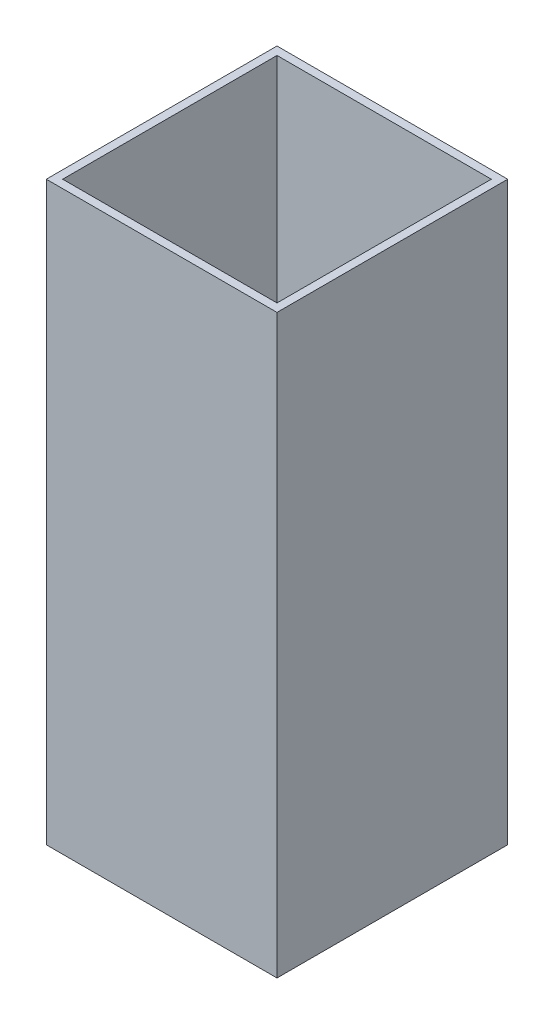
ISO-10303-21;
HEADER;
FILE_DESCRIPTION(('STEP AP214'),'2;1');
FILE_NAME('part.step','',(''),(''),'','','');
FILE_SCHEMA(('AUTOMOTIVE_DESIGN { 1 0 10303 214 1 1 1 1 }'));
ENDSEC;
DATA;
#1=APPLICATION_CONTEXT('core data for automotive mechanical design processes');
#2=APPLICATION_PROTOCOL_DEFINITION('international standard','automotive_design',2000,#1);
#3=PRODUCT_CONTEXT('',#1,'mechanical');
#4=PRODUCT('Part','Part','',(#3));
#5=PRODUCT_RELATED_PRODUCT_CATEGORY('part','',(#4));
#6=PRODUCT_DEFINITION_FORMATION('','',#4);
#7=PRODUCT_DEFINITION_CONTEXT('part definition',#1,'design');
#8=PRODUCT_DEFINITION('design','',#6,#7);
#9=PRODUCT_DEFINITION_SHAPE('','',#8);
#10=(LENGTH_UNIT() NAMED_UNIT(*) SI_UNIT(.MILLI.,.METRE.));
#11=(NAMED_UNIT(*) PLANE_ANGLE_UNIT() SI_UNIT($,.RADIAN.));
#12=(NAMED_UNIT(*) SI_UNIT($,.STERADIAN.) SOLID_ANGLE_UNIT());
#13=UNCERTAINTY_MEASURE_WITH_UNIT(LENGTH_MEASURE(1.E-05),#10,'distance_accuracy_value','');
#14=(GEOMETRIC_REPRESENTATION_CONTEXT(3) GLOBAL_UNCERTAINTY_ASSIGNED_CONTEXT((#13)) GLOBAL_UNIT_ASSIGNED_CONTEXT((#10,
#11,#12)) REPRESENTATION_CONTEXT('',''));
#15=CARTESIAN_POINT('',(0.,0.,0.));
#16=DIRECTION('',(0.,0.,1.));
#17=DIRECTION('',(1.,0.,0.));
#18=AXIS2_PLACEMENT_3D('',#15,#16,#17);
#19=CARTESIAN_POINT('',(50.75,3.6,-50.75));
#20=DIRECTION('',(-1.,0.,0.));
#21=DIRECTION('',(0.,0.,1.));
#22=AXIS2_PLACEMENT_3D('',#19,#20,#21);
#23=PLANE('',#22);
#24=DIRECTION('',(0.,0.,-1.));
#25=VECTOR('',#24,1.);
#26=CARTESIAN_POINT('',(50.75,0.,-50.75));
#27=LINE('',#26,#25);
#28=CARTESIAN_POINT('',(50.75,0.,50.75));
#29=VERTEX_POINT('',#28);
#30=CARTESIAN_POINT('',(50.75,0.,-50.75));
#31=VERTEX_POINT('',#30);
#32=EDGE_CURVE('E147',#29,#31,#27,.T.);
#33=ORIENTED_EDGE('',*,*,#32,.T.);
#34=DIRECTION('',(0.,-1.,0.));
#35=VECTOR('',#34,1.);
#36=CARTESIAN_POINT('',(50.75,3.6,-50.75));
#37=LINE('',#36,#35);
#38=CARTESIAN_POINT('',(50.75,253.6,-50.75));
#39=VERTEX_POINT('',#38);
#40=EDGE_CURVE('E11',#39,#31,#37,.T.);
#41=ORIENTED_EDGE('',*,*,#40,.F.);
#42=DIRECTION('',(0.,0.,-1.));
#43=VECTOR('',#42,1.);
#44=CARTESIAN_POINT('',(50.75,253.6,50.75));
#45=LINE('',#44,#43);
#46=CARTESIAN_POINT('',(50.75,253.6,50.75));
#47=VERTEX_POINT('',#46);
#48=EDGE_CURVE('E138',#47,#39,#45,.T.);
#49=ORIENTED_EDGE('',*,*,#48,.F.);
#50=DIRECTION('',(0.,-1.,0.));
#51=VECTOR('',#50,1.);
#52=CARTESIAN_POINT('',(50.75,3.6,50.75));
#53=LINE('',#52,#51);
#54=EDGE_CURVE('E156',#47,#29,#53,.T.);
#55=ORIENTED_EDGE('',*,*,#54,.T.);
#56=EDGE_LOOP('',(#33,#41,#49,#55));
#57=FACE_BOUND('',#56,.T.);
#58=ADVANCED_FACE('F36',(#57),#23,.F.);
#59=CARTESIAN_POINT('',(-50.75,3.6,-50.75));
#60=DIRECTION('',(0.,0.,1.));
#61=DIRECTION('',(1.,0.,0.));
#62=AXIS2_PLACEMENT_3D('',#59,#60,#61);
#63=PLANE('',#62);
#64=DIRECTION('',(-1.,0.,0.));
#65=VECTOR('',#64,1.);
#66=CARTESIAN_POINT('',(-50.75,0.,-50.75));
#67=LINE('',#66,#65);
#68=CARTESIAN_POINT('',(-50.75,0.,-50.75));
#69=VERTEX_POINT('',#68);
#70=EDGE_CURVE('E150',#31,#69,#67,.T.);
#71=ORIENTED_EDGE('',*,*,#70,.T.);
#72=DIRECTION('',(0.,-1.,0.));
#73=VECTOR('',#72,1.);
#74=CARTESIAN_POINT('',(-50.75,3.6,-50.75));
#75=LINE('',#74,#73);
#76=CARTESIAN_POINT('',(-50.75,253.6,-50.75));
#77=VERTEX_POINT('',#76);
#78=EDGE_CURVE('E43',#77,#69,#75,.T.);
#79=ORIENTED_EDGE('',*,*,#78,.F.);
#80=DIRECTION('',(-1.,0.,0.));
#81=VECTOR('',#80,1.);
#82=CARTESIAN_POINT('',(50.75,253.6,-50.75));
#83=LINE('',#82,#81);
#84=EDGE_CURVE('E141',#39,#77,#83,.T.);
#85=ORIENTED_EDGE('',*,*,#84,.F.);
#86=ORIENTED_EDGE('',*,*,#40,.T.);
#87=EDGE_LOOP('',(#71,#79,#85,#86));
#88=FACE_BOUND('',#87,.T.);
#89=ADVANCED_FACE('F178',(#88),#63,.F.);
#90=CARTESIAN_POINT('',(-50.75,3.6,-50.75));
#91=DIRECTION('',(1.,0.,0.));
#92=DIRECTION('',(0.,0.,-1.));
#93=AXIS2_PLACEMENT_3D('',#90,#91,#92);
#94=PLANE('',#93);
#95=DIRECTION('',(0.,0.,1.));
#96=VECTOR('',#95,1.);
#97=CARTESIAN_POINT('',(-50.75,0.,-50.75));
#98=LINE('',#97,#96);
#99=CARTESIAN_POINT('',(-50.75,0.,50.75));
#100=VERTEX_POINT('',#99);
#101=EDGE_CURVE('E152',#69,#100,#98,.T.);
#102=ORIENTED_EDGE('',*,*,#101,.T.);
#103=DIRECTION('',(0.,-1.,0.));
#104=VECTOR('',#103,1.);
#105=CARTESIAN_POINT('',(-50.75,3.6,50.75));
#106=LINE('',#105,#104);
#107=CARTESIAN_POINT('',(-50.75,253.6,50.75));
#108=VERTEX_POINT('',#107);
#109=EDGE_CURVE('E159',#108,#100,#106,.T.);
#110=ORIENTED_EDGE('',*,*,#109,.F.);
#111=DIRECTION('',(0.,0.,1.));
#112=VECTOR('',#111,1.);
#113=CARTESIAN_POINT('',(-50.75,253.6,-50.75));
#114=LINE('',#113,#112);
#115=EDGE_CURVE('E144',#77,#108,#114,.T.);
#116=ORIENTED_EDGE('',*,*,#115,.F.);
#117=ORIENTED_EDGE('',*,*,#78,.T.);
#118=EDGE_LOOP('',(#102,#110,#116,#117));
#119=FACE_BOUND('',#118,.T.);
#120=ADVANCED_FACE('F165',(#119),#94,.F.);
#121=CARTESIAN_POINT('',(-50.75,3.6,50.75));
#122=DIRECTION('',(0.,0.,-1.));
#123=DIRECTION('',(-1.,0.,0.));
#124=AXIS2_PLACEMENT_3D('',#121,#122,#123);
#125=PLANE('',#124);
#126=DIRECTION('',(1.,0.,0.));
#127=VECTOR('',#126,1.);
#128=CARTESIAN_POINT('',(-50.75,0.,50.75));
#129=LINE('',#128,#127);
#130=EDGE_CURVE('E154',#100,#29,#129,.T.);
#131=ORIENTED_EDGE('',*,*,#130,.T.);
#132=ORIENTED_EDGE('',*,*,#54,.F.);
#133=DIRECTION('',(1.,0.,0.));
#134=VECTOR('',#133,1.);
#135=CARTESIAN_POINT('',(-50.75,253.6,50.75));
#136=LINE('',#135,#134);
#137=EDGE_CURVE('E114',#108,#47,#136,.T.);
#138=ORIENTED_EDGE('',*,*,#137,.F.);
#139=ORIENTED_EDGE('',*,*,#109,.T.);
#140=EDGE_LOOP('',(#131,#132,#138,#139));
#141=FACE_BOUND('',#140,.T.);
#142=ADVANCED_FACE('F173',(#141),#125,.F.);
#143=CARTESIAN_POINT('',(0.,0.,0.));
#144=DIRECTION('',(0.,1.,0.));
#145=DIRECTION('',(0.,0.,1.));
#146=AXIS2_PLACEMENT_3D('',#143,#144,#145);
#147=PLANE('',#146);
#148=ORIENTED_EDGE('',*,*,#32,.F.);
#149=ORIENTED_EDGE('',*,*,#130,.F.);
#150=ORIENTED_EDGE('',*,*,#101,.F.);
#151=ORIENTED_EDGE('',*,*,#70,.F.);
#152=EDGE_LOOP('',(#148,#149,#150,#151));
#153=FACE_BOUND('',#152,.T.);
#154=ADVANCED_FACE('F171',(#153),#147,.F.);
#155=CARTESIAN_POINT('',(0.,253.6,0.));
#156=DIRECTION('',(0.,1.,0.));
#157=DIRECTION('',(0.,0.,1.));
#158=AXIS2_PLACEMENT_3D('',#155,#156,#157);
#159=PLANE('',#158);
#160=ORIENTED_EDGE('',*,*,#137,.T.);
#161=ORIENTED_EDGE('',*,*,#48,.T.);
#162=ORIENTED_EDGE('',*,*,#84,.T.);
#163=ORIENTED_EDGE('',*,*,#115,.T.);
#164=EDGE_LOOP('',(#160,#161,#162,#163));
#165=FACE_BOUND('',#164,.T.);
#166=DIRECTION('',(0.,0.,-1.));
#167=VECTOR('',#166,1.);
#168=CARTESIAN_POINT('',(47.15,253.6,47.15));
#169=LINE('',#168,#167);
#170=CARTESIAN_POINT('',(47.15,253.6,47.15));
#171=VERTEX_POINT('',#170);
#172=CARTESIAN_POINT('',(47.15,253.6,-47.15));
#173=VERTEX_POINT('',#172);
#174=EDGE_CURVE('E108',#171,#173,#169,.T.);
#175=ORIENTED_EDGE('',*,*,#174,.F.);
#176=DIRECTION('',(1.,0.,0.));
#177=VECTOR('',#176,1.);
#178=CARTESIAN_POINT('',(-47.15,253.6,47.15));
#179=LINE('',#178,#177);
#180=CARTESIAN_POINT('',(-47.15,253.6,47.15));
#181=VERTEX_POINT('',#180);
#182=EDGE_CURVE('E99',#181,#171,#179,.T.);
#183=ORIENTED_EDGE('',*,*,#182,.F.);
#184=DIRECTION('',(0.,0.,1.));
#185=VECTOR('',#184,1.);
#186=CARTESIAN_POINT('',(-47.15,253.6,-47.15));
#187=LINE('',#186,#185);
#188=CARTESIAN_POINT('',(-47.15,253.6,-47.15));
#189=VERTEX_POINT('',#188);
#190=EDGE_CURVE('E122',#189,#181,#187,.T.);
#191=ORIENTED_EDGE('',*,*,#190,.F.);
#192=DIRECTION('',(-1.,0.,0.));
#193=VECTOR('',#192,1.);
#194=CARTESIAN_POINT('',(47.15,253.6,-47.15));
#195=LINE('',#194,#193);
#196=EDGE_CURVE('E120',#173,#189,#195,.T.);
#197=ORIENTED_EDGE('',*,*,#196,.F.);
#198=EDGE_LOOP('',(#175,#183,#191,#197));
#199=FACE_BOUND('',#198,.T.);
#200=ADVANCED_FACE('F118',(#165,#199),#159,.T.);
#201=CARTESIAN_POINT('',(-47.15,253.6,47.15));
#202=DIRECTION('',(0.,0.,-1.));
#203=DIRECTION('',(-1.,0.,0.));
#204=AXIS2_PLACEMENT_3D('',#201,#202,#203);
#205=PLANE('',#204);
#206=DIRECTION('',(1.,0.,0.));
#207=VECTOR('',#206,1.);
#208=CARTESIAN_POINT('',(-47.15,3.6,47.15));
#209=LINE('',#208,#207);
#210=CARTESIAN_POINT('',(-47.15,3.6,47.15));
#211=VERTEX_POINT('',#210);
#212=CARTESIAN_POINT('',(47.15,3.6,47.15));
#213=VERTEX_POINT('',#212);
#214=EDGE_CURVE('E50',#211,#213,#209,.T.);
#215=ORIENTED_EDGE('',*,*,#214,.F.);
#216=DIRECTION('',(0.,-1.,0.));
#217=VECTOR('',#216,1.);
#218=CARTESIAN_POINT('',(-47.15,253.6,47.15));
#219=LINE('',#218,#217);
#220=EDGE_CURVE('E104',#181,#211,#219,.T.);
#221=ORIENTED_EDGE('',*,*,#220,.F.);
#222=ORIENTED_EDGE('',*,*,#182,.T.);
#223=DIRECTION('',(0.,-1.,0.));
#224=VECTOR('',#223,1.);
#225=CARTESIAN_POINT('',(47.15,253.6,47.15));
#226=LINE('',#225,#224);
#227=EDGE_CURVE('E102',#171,#213,#226,.T.);
#228=ORIENTED_EDGE('',*,*,#227,.T.);
#229=EDGE_LOOP('',(#215,#221,#222,#228));
#230=FACE_BOUND('',#229,.T.);
#231=ADVANCED_FACE('F101',(#230),#205,.T.);
#232=CARTESIAN_POINT('',(47.15,253.6,47.15));
#233=DIRECTION('',(-1.,0.,0.));
#234=DIRECTION('',(0.,0.,1.));
#235=AXIS2_PLACEMENT_3D('',#232,#233,#234);
#236=PLANE('',#235);
#237=DIRECTION('',(0.,0.,-1.));
#238=VECTOR('',#237,1.);
#239=CARTESIAN_POINT('',(47.15,3.6,47.15));
#240=LINE('',#239,#238);
#241=CARTESIAN_POINT('',(47.15,3.6,-47.15));
#242=VERTEX_POINT('',#241);
#243=EDGE_CURVE('E54',#213,#242,#240,.T.);
#244=ORIENTED_EDGE('',*,*,#243,.F.);
#245=ORIENTED_EDGE('',*,*,#227,.F.);
#246=ORIENTED_EDGE('',*,*,#174,.T.);
#247=DIRECTION('',(0.,-1.,0.));
#248=VECTOR('',#247,1.);
#249=CARTESIAN_POINT('',(47.15,253.6,-47.15));
#250=LINE('',#249,#248);
#251=EDGE_CURVE('E115',#173,#242,#250,.T.);
#252=ORIENTED_EDGE('',*,*,#251,.T.);
#253=EDGE_LOOP('',(#244,#245,#246,#252));
#254=FACE_BOUND('',#253,.T.);
#255=ADVANCED_FACE('F112',(#254),#236,.T.);
#256=CARTESIAN_POINT('',(47.15,253.6,-47.15));
#257=DIRECTION('',(0.,0.,1.));
#258=DIRECTION('',(1.,0.,0.));
#259=AXIS2_PLACEMENT_3D('',#256,#257,#258);
#260=PLANE('',#259);
#261=DIRECTION('',(-1.,0.,0.));
#262=VECTOR('',#261,1.);
#263=CARTESIAN_POINT('',(47.15,3.6,-47.15));
#264=LINE('',#263,#262);
#265=CARTESIAN_POINT('',(-47.15,3.6,-47.15));
#266=VERTEX_POINT('',#265);
#267=EDGE_CURVE('E128',#242,#266,#264,.T.);
#268=ORIENTED_EDGE('',*,*,#267,.F.);
#269=ORIENTED_EDGE('',*,*,#251,.F.);
#270=ORIENTED_EDGE('',*,*,#196,.T.);
#271=DIRECTION('',(0.,-1.,0.));
#272=VECTOR('',#271,1.);
#273=CARTESIAN_POINT('',(-47.15,253.6,-47.15));
#274=LINE('',#273,#272);
#275=EDGE_CURVE('E132',#189,#266,#274,.T.);
#276=ORIENTED_EDGE('',*,*,#275,.T.);
#277=EDGE_LOOP('',(#268,#269,#270,#276));
#278=FACE_BOUND('',#277,.T.);
#279=ADVANCED_FACE('F200',(#278),#260,.T.);
#280=CARTESIAN_POINT('',(-47.15,253.6,-47.15));
#281=DIRECTION('',(1.,0.,0.));
#282=DIRECTION('',(0.,0.,-1.));
#283=AXIS2_PLACEMENT_3D('',#280,#281,#282);
#284=PLANE('',#283);
#285=DIRECTION('',(0.,0.,1.));
#286=VECTOR('',#285,1.);
#287=CARTESIAN_POINT('',(-47.15,3.6,-47.15));
#288=LINE('',#287,#286);
#289=EDGE_CURVE('E109',#266,#211,#288,.T.);
#290=ORIENTED_EDGE('',*,*,#289,.F.);
#291=ORIENTED_EDGE('',*,*,#275,.F.);
#292=ORIENTED_EDGE('',*,*,#190,.T.);
#293=ORIENTED_EDGE('',*,*,#220,.T.);
#294=EDGE_LOOP('',(#290,#291,#292,#293));
#295=FACE_BOUND('',#294,.T.);
#296=ADVANCED_FACE('F193',(#295),#284,.T.);
#297=CARTESIAN_POINT('',(0.,3.6,0.));
#298=DIRECTION('',(0.,1.,0.));
#299=DIRECTION('',(0.,0.,1.));
#300=AXIS2_PLACEMENT_3D('',#297,#298,#299);
#301=PLANE('',#300);
#302=ORIENTED_EDGE('',*,*,#214,.T.);
#303=ORIENTED_EDGE('',*,*,#243,.T.);
#304=ORIENTED_EDGE('',*,*,#267,.T.);
#305=ORIENTED_EDGE('',*,*,#289,.T.);
#306=EDGE_LOOP('',(#302,#303,#304,#305));
#307=FACE_BOUND('',#306,.T.);
#308=ADVANCED_FACE('F190',(#307),#301,.T.);
#309=CLOSED_SHELL('',(#58,#89,#120,#142,#154,#200,#231,#255,#279,#296,#308));
#310=MANIFOLD_SOLID_BREP('B2',#309);
#311=ADVANCED_BREP_SHAPE_REPRESENTATION('',(#18,#310),#14);
#312=SHAPE_DEFINITION_REPRESENTATION(#9,#311);
ENDSEC;
END-ISO-10303-21;
